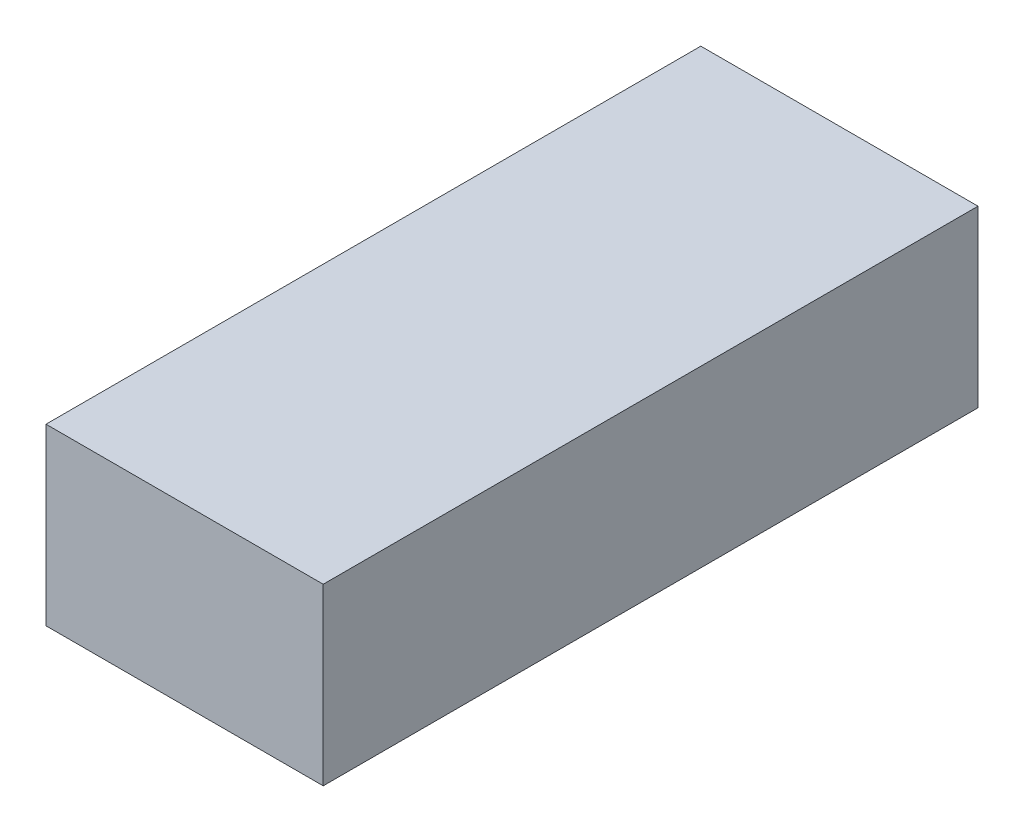
ISO-10303-21;
HEADER;
FILE_DESCRIPTION(('STEP AP214'),'2;1');
FILE_NAME('part.step','',(''),(''),'','','');
FILE_SCHEMA(('AUTOMOTIVE_DESIGN { 1 0 10303 214 1 1 1 1 }'));
ENDSEC;
DATA;
#1=APPLICATION_CONTEXT('core data for automotive mechanical design processes');
#2=APPLICATION_PROTOCOL_DEFINITION('international standard','automotive_design',2000,#1);
#3=PRODUCT_CONTEXT('',#1,'mechanical');
#4=PRODUCT('Part','Part','',(#3));
#5=PRODUCT_RELATED_PRODUCT_CATEGORY('part','',(#4));
#6=PRODUCT_DEFINITION_FORMATION('','',#4);
#7=PRODUCT_DEFINITION_CONTEXT('part definition',#1,'design');
#8=PRODUCT_DEFINITION('design','',#6,#7);
#9=PRODUCT_DEFINITION_SHAPE('','',#8);
#10=(LENGTH_UNIT() NAMED_UNIT(*) SI_UNIT(.MILLI.,.METRE.));
#11=(NAMED_UNIT(*) PLANE_ANGLE_UNIT() SI_UNIT($,.RADIAN.));
#12=(NAMED_UNIT(*) SI_UNIT($,.STERADIAN.) SOLID_ANGLE_UNIT());
#13=UNCERTAINTY_MEASURE_WITH_UNIT(LENGTH_MEASURE(1.E-05),#10,'distance_accuracy_value','');
#14=(GEOMETRIC_REPRESENTATION_CONTEXT(3) GLOBAL_UNCERTAINTY_ASSIGNED_CONTEXT((#13)) GLOBAL_UNIT_ASSIGNED_CONTEXT((#10,
#11,#12)) REPRESENTATION_CONTEXT('',''));
#15=CARTESIAN_POINT('',(0.,0.,0.));
#16=DIRECTION('',(0.,0.,1.));
#17=DIRECTION('',(1.,0.,0.));
#18=AXIS2_PLACEMENT_3D('',#15,#16,#17);
#19=CARTESIAN_POINT('',(0.635,0.40000174,0.));
#20=DIRECTION('',(0.,-1.,0.));
#21=DIRECTION('',(0.,0.,-1.));
#22=AXIS2_PLACEMENT_3D('',#19,#20,#21);
#23=PLANE('',#22);
#24=DIRECTION('',(0.,0.,-1.));
#25=VECTOR('',#24,1.);
#26=CARTESIAN_POINT('',(-0.635,0.40000174,0.));
#27=LINE('',#26,#25);
#28=CARTESIAN_POINT('',(-0.635,0.40000174,0.));
#29=VERTEX_POINT('',#28);
#30=CARTESIAN_POINT('',(-0.635,0.40000174,2.99999908));
#31=VERTEX_POINT('',#30);
#32=EDGE_CURVE('E65',#29,#31,#27,.F.);
#33=ORIENTED_EDGE('',*,*,#32,.T.);
#34=DIRECTION('',(-1.,0.,0.));
#35=VECTOR('',#34,1.);
#36=CARTESIAN_POINT('',(-0.635,0.40000174,2.99999908));
#37=LINE('',#36,#35);
#38=CARTESIAN_POINT('',(0.635,0.40000174,2.99999908));
#39=VERTEX_POINT('',#38);
#40=EDGE_CURVE('E55',#31,#39,#37,.F.);
#41=ORIENTED_EDGE('',*,*,#40,.T.);
#42=DIRECTION('',(0.,0.,1.));
#43=VECTOR('',#42,1.);
#44=CARTESIAN_POINT('',(0.635,0.40000174,0.));
#45=LINE('',#44,#43);
#46=CARTESIAN_POINT('',(0.635,0.40000174,0.));
#47=VERTEX_POINT('',#46);
#48=EDGE_CURVE('E75',#39,#47,#45,.F.);
#49=ORIENTED_EDGE('',*,*,#48,.T.);
#50=DIRECTION('',(1.,0.,0.));
#51=VECTOR('',#50,1.);
#52=CARTESIAN_POINT('',(0.635,0.40000174,0.));
#53=LINE('',#52,#51);
#54=EDGE_CURVE('E20',#29,#47,#53,.T.);
#55=ORIENTED_EDGE('',*,*,#54,.F.);
#56=EDGE_LOOP('',(#33,#41,#49,#55));
#57=FACE_BOUND('',#56,.T.);
#58=ADVANCED_FACE('F17',(#57),#23,.F.);
#59=CARTESIAN_POINT('',(-0.635,0.40000174,0.));
#60=DIRECTION('',(1.,0.,0.));
#61=DIRECTION('',(0.,0.,-1.));
#62=AXIS2_PLACEMENT_3D('',#59,#60,#61);
#63=PLANE('',#62);
#64=DIRECTION('',(0.,0.,1.));
#65=VECTOR('',#64,1.);
#66=CARTESIAN_POINT('',(-0.635,-0.3999992,0.));
#67=LINE('',#66,#65);
#68=CARTESIAN_POINT('',(-0.635,-0.3999992,0.));
#69=VERTEX_POINT('',#68);
#70=CARTESIAN_POINT('',(-0.635,-0.3999992,2.99999908));
#71=VERTEX_POINT('',#70);
#72=EDGE_CURVE('E73',#69,#71,#67,.T.);
#73=ORIENTED_EDGE('',*,*,#72,.T.);
#74=DIRECTION('',(0.,1.,0.));
#75=VECTOR('',#74,1.);
#76=CARTESIAN_POINT('',(-0.635,0.40000174,2.99999908));
#77=LINE('',#76,#75);
#78=EDGE_CURVE('E62',#71,#31,#77,.T.);
#79=ORIENTED_EDGE('',*,*,#78,.T.);
#80=ORIENTED_EDGE('',*,*,#32,.F.);
#81=DIRECTION('',(0.,1.,0.));
#82=VECTOR('',#81,1.);
#83=CARTESIAN_POINT('',(-0.635,0.40000174,0.));
#84=LINE('',#83,#82);
#85=EDGE_CURVE('E80',#69,#29,#84,.T.);
#86=ORIENTED_EDGE('',*,*,#85,.F.);
#87=EDGE_LOOP('',(#73,#79,#80,#86));
#88=FACE_BOUND('',#87,.T.);
#89=ADVANCED_FACE('F72',(#88),#63,.F.);
#90=CARTESIAN_POINT('',(-0.635,0.40000174,2.99999908));
#91=DIRECTION('',(0.,0.,-1.));
#92=DIRECTION('',(-1.,0.,0.));
#93=AXIS2_PLACEMENT_3D('',#90,#91,#92);
#94=PLANE('',#93);
#95=DIRECTION('',(1.,0.,0.));
#96=VECTOR('',#95,1.);
#97=CARTESIAN_POINT('',(-0.635,-0.3999992,2.99999908));
#98=LINE('',#97,#96);
#99=CARTESIAN_POINT('',(0.635,-0.3999992,2.99999908));
#100=VERTEX_POINT('',#99);
#101=EDGE_CURVE('E83',#71,#100,#98,.T.);
#102=ORIENTED_EDGE('',*,*,#101,.T.);
#103=DIRECTION('',(0.,1.,0.));
#104=VECTOR('',#103,1.);
#105=CARTESIAN_POINT('',(0.635,-0.3999992,2.99999908));
#106=LINE('',#105,#104);
#107=EDGE_CURVE('E64',#100,#39,#106,.T.);
#108=ORIENTED_EDGE('',*,*,#107,.T.);
#109=ORIENTED_EDGE('',*,*,#40,.F.);
#110=ORIENTED_EDGE('',*,*,#78,.F.);
#111=EDGE_LOOP('',(#102,#108,#109,#110));
#112=FACE_BOUND('',#111,.T.);
#113=ADVANCED_FACE('F60',(#112),#94,.F.);
#114=CARTESIAN_POINT('',(0.635,-0.3999992,0.));
#115=DIRECTION('',(-1.,0.,0.));
#116=DIRECTION('',(0.,0.,1.));
#117=AXIS2_PLACEMENT_3D('',#114,#115,#116);
#118=PLANE('',#117);
#119=ORIENTED_EDGE('',*,*,#48,.F.);
#120=ORIENTED_EDGE('',*,*,#107,.F.);
#121=DIRECTION('',(0.,0.,1.));
#122=VECTOR('',#121,1.);
#123=CARTESIAN_POINT('',(0.635,-0.3999992,0.));
#124=LINE('',#123,#122);
#125=CARTESIAN_POINT('',(0.635,-0.3999992,0.));
#126=VERTEX_POINT('',#125);
#127=EDGE_CURVE('E26',#100,#126,#124,.F.);
#128=ORIENTED_EDGE('',*,*,#127,.T.);
#129=DIRECTION('',(0.,1.,0.));
#130=VECTOR('',#129,1.);
#131=CARTESIAN_POINT('',(0.635,0.40000174,0.));
#132=LINE('',#131,#130);
#133=EDGE_CURVE('E34',#47,#126,#132,.F.);
#134=ORIENTED_EDGE('',*,*,#133,.F.);
#135=EDGE_LOOP('',(#119,#120,#128,#134));
#136=FACE_BOUND('',#135,.T.);
#137=ADVANCED_FACE('F88',(#136),#118,.F.);
#138=CARTESIAN_POINT('',(-0.635,0.40000174,0.));
#139=DIRECTION('',(0.,0.,-1.));
#140=DIRECTION('',(-1.,0.,0.));
#141=AXIS2_PLACEMENT_3D('',#138,#139,#140);
#142=PLANE('',#141);
#143=DIRECTION('',(1.,0.,0.));
#144=VECTOR('',#143,1.);
#145=CARTESIAN_POINT('',(-0.635,-0.3999992,0.));
#146=LINE('',#145,#144);
#147=EDGE_CURVE('E11',#126,#69,#146,.F.);
#148=ORIENTED_EDGE('',*,*,#147,.T.);
#149=ORIENTED_EDGE('',*,*,#85,.T.);
#150=ORIENTED_EDGE('',*,*,#54,.T.);
#151=ORIENTED_EDGE('',*,*,#133,.T.);
#152=EDGE_LOOP('',(#148,#149,#150,#151));
#153=FACE_BOUND('',#152,.T.);
#154=ADVANCED_FACE('F91',(#153),#142,.T.);
#155=CARTESIAN_POINT('',(-0.635,-0.3999992,0.));
#156=DIRECTION('',(0.,1.,0.));
#157=DIRECTION('',(0.,0.,1.));
#158=AXIS2_PLACEMENT_3D('',#155,#156,#157);
#159=PLANE('',#158);
#160=ORIENTED_EDGE('',*,*,#127,.F.);
#161=ORIENTED_EDGE('',*,*,#101,.F.);
#162=ORIENTED_EDGE('',*,*,#72,.F.);
#163=ORIENTED_EDGE('',*,*,#147,.F.);
#164=EDGE_LOOP('',(#160,#161,#162,#163));
#165=FACE_BOUND('',#164,.T.);
#166=ADVANCED_FACE('F90',(#165),#159,.F.);
#167=CLOSED_SHELL('',(#58,#89,#113,#137,#154,#166));
#168=MANIFOLD_SOLID_BREP('B1',#167);
#169=ADVANCED_BREP_SHAPE_REPRESENTATION('',(#18,#168),#14);
#170=SHAPE_DEFINITION_REPRESENTATION(#9,#169);
ENDSEC;
END-ISO-10303-21;
